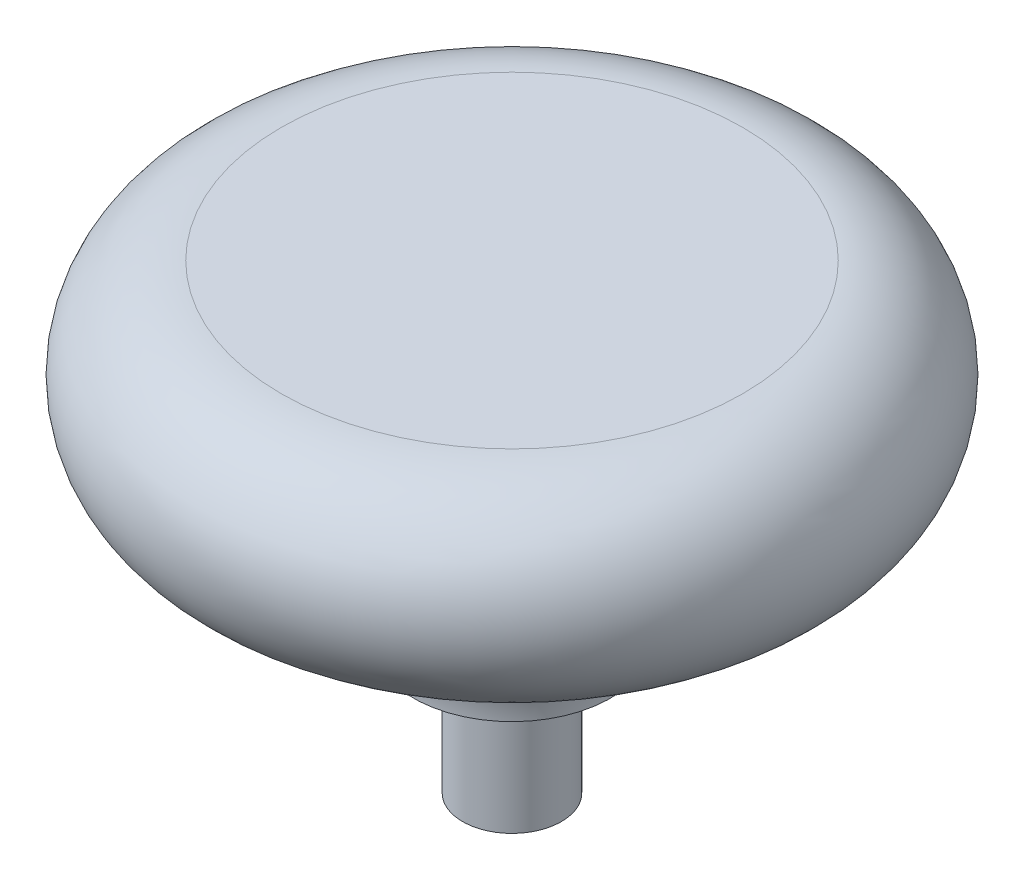
ISO-10303-21;
HEADER;
FILE_DESCRIPTION(('STEP AP214'),'2;1');
FILE_NAME('part.step','',(''),(''),'','','');
FILE_SCHEMA(('AUTOMOTIVE_DESIGN { 1 0 10303 214 1 1 1 1 }'));
ENDSEC;
DATA;
#1=APPLICATION_CONTEXT('core data for automotive mechanical design processes');
#2=APPLICATION_PROTOCOL_DEFINITION('international standard','automotive_design',2000,#1);
#3=PRODUCT_CONTEXT('',#1,'mechanical');
#4=PRODUCT('Part','Part','',(#3));
#5=PRODUCT_RELATED_PRODUCT_CATEGORY('part','',(#4));
#6=PRODUCT_DEFINITION_FORMATION('','',#4);
#7=PRODUCT_DEFINITION_CONTEXT('part definition',#1,'design');
#8=PRODUCT_DEFINITION('design','',#6,#7);
#9=PRODUCT_DEFINITION_SHAPE('','',#8);
#10=(LENGTH_UNIT() NAMED_UNIT(*) SI_UNIT(.MILLI.,.METRE.));
#11=(NAMED_UNIT(*) PLANE_ANGLE_UNIT() SI_UNIT($,.RADIAN.));
#12=(NAMED_UNIT(*) SI_UNIT($,.STERADIAN.) SOLID_ANGLE_UNIT());
#13=UNCERTAINTY_MEASURE_WITH_UNIT(LENGTH_MEASURE(1.E-05),#10,'distance_accuracy_value','');
#14=(GEOMETRIC_REPRESENTATION_CONTEXT(3) GLOBAL_UNCERTAINTY_ASSIGNED_CONTEXT((#13)) GLOBAL_UNIT_ASSIGNED_CONTEXT((#10,
#11,#12)) REPRESENTATION_CONTEXT('',''));
#15=CARTESIAN_POINT('',(0.,0.,0.));
#16=DIRECTION('',(0.,0.,1.));
#17=DIRECTION('',(1.,0.,0.));
#18=AXIS2_PLACEMENT_3D('',#15,#16,#17);
#19=CARTESIAN_POINT('',(0.,0.,0.));
#20=DIRECTION('',(0.,-1.,0.));
#21=DIRECTION('',(0.,0.,-1.));
#22=AXIS2_PLACEMENT_3D('',#19,#20,#21);
#23=PLANE('',#22);
#24=CARTESIAN_POINT('',(0.,0.,0.));
#25=DIRECTION('',(0.,-1.,0.));
#26=DIRECTION('',(0.,0.,-1.));
#27=AXIS2_PLACEMENT_3D('',#24,#25,#26);
#28=CIRCLE('',#27,2.38);
#29=CARTESIAN_POINT('',(0.,0.,-2.38));
#30=VERTEX_POINT('',#29);
#31=EDGE_CURVE('E10',#30,#30,#28,.T.);
#32=ORIENTED_EDGE('',*,*,#31,.T.);
#33=EDGE_LOOP('',(#32));
#34=FACE_BOUND('',#33,.T.);
#35=ADVANCED_FACE('F31',(#34),#23,.T.);
#36=CARTESIAN_POINT('',(0.,0.,0.));
#37=DIRECTION('',(0.,-1.,0.));
#38=DIRECTION('',(0.,0.,-1.));
#39=AXIS2_PLACEMENT_3D('',#36,#37,#38);
#40=CYLINDRICAL_SURFACE('',#39,2.38);
#41=CARTESIAN_POINT('',(0.,6.35,0.));
#42=DIRECTION('',(0.,-1.,0.));
#43=DIRECTION('',(0.,0.,-1.));
#44=AXIS2_PLACEMENT_3D('',#41,#42,#43);
#45=CIRCLE('',#44,2.38);
#46=CARTESIAN_POINT('',(0.,6.35,-2.38));
#47=VERTEX_POINT('',#46);
#48=EDGE_CURVE('E37',#47,#47,#45,.T.);
#49=ORIENTED_EDGE('',*,*,#48,.T.);
#50=EDGE_LOOP('',(#49));
#51=FACE_BOUND('',#50,.T.);
#52=ORIENTED_EDGE('',*,*,#31,.F.);
#53=EDGE_LOOP('',(#52));
#54=FACE_BOUND('',#53,.T.);
#55=ADVANCED_FACE('F66',(#51,#54),#40,.T.);
#56=CARTESIAN_POINT('',(2.38,6.35,0.));
#57=DIRECTION('',(0.,-1.,0.));
#58=DIRECTION('',(0.,0.,-1.));
#59=AXIS2_PLACEMENT_3D('',#56,#57,#58);
#60=PLANE('',#59);
#61=CARTESIAN_POINT('',(0.,6.35,0.));
#62=DIRECTION('',(0.,-1.,0.));
#63=DIRECTION('',(0.,0.,-1.));
#64=AXIS2_PLACEMENT_3D('',#61,#62,#63);
#65=CIRCLE('',#64,4.765);
#66=CARTESIAN_POINT('',(0.,6.35,-4.765));
#67=VERTEX_POINT('',#66);
#68=EDGE_CURVE('E41',#67,#67,#65,.T.);
#69=ORIENTED_EDGE('',*,*,#68,.T.);
#70=EDGE_LOOP('',(#69));
#71=FACE_BOUND('',#70,.T.);
#72=ORIENTED_EDGE('',*,*,#48,.F.);
#73=EDGE_LOOP('',(#72));
#74=FACE_BOUND('',#73,.T.);
#75=ADVANCED_FACE('F70',(#71,#74),#60,.T.);
#76=CARTESIAN_POINT('',(0.,6.35,0.));
#77=DIRECTION('',(0.,-1.,0.));
#78=DIRECTION('',(0.,0.,-1.));
#79=AXIS2_PLACEMENT_3D('',#76,#77,#78);
#80=TOROIDAL_SURFACE('',#79,11.115,6.35);
#81=CARTESIAN_POINT('',(0.,12.7,0.));
#82=DIRECTION('',(0.,-1.,0.));
#83=DIRECTION('',(0.,0.,-1.));
#84=AXIS2_PLACEMENT_3D('',#81,#82,#83);
#85=CIRCLE('',#84,11.115);
#86=CARTESIAN_POINT('',(0.,12.7,-11.115));
#87=VERTEX_POINT('',#86);
#88=EDGE_CURVE('E45',#87,#87,#85,.T.);
#89=ORIENTED_EDGE('',*,*,#88,.T.);
#90=EDGE_LOOP('',(#89));
#91=FACE_BOUND('',#90,.T.);
#92=ORIENTED_EDGE('',*,*,#68,.F.);
#93=EDGE_LOOP('',(#92));
#94=FACE_BOUND('',#93,.T.);
#95=ADVANCED_FACE('F63',(#91,#94),#80,.F.);
#96=CARTESIAN_POINT('',(0.,17.46,0.));
#97=DIRECTION('',(0.,-1.,0.));
#98=DIRECTION('',(0.,0.,-1.));
#99=AXIS2_PLACEMENT_3D('',#96,#97,#98);
#100=TOROIDAL_SURFACE('',#99,11.115,4.76);
#101=CARTESIAN_POINT('',(0.,22.22,0.));
#102=DIRECTION('',(0.,-1.,0.));
#103=DIRECTION('',(0.,0.,-1.));
#104=AXIS2_PLACEMENT_3D('',#101,#102,#103);
#105=CIRCLE('',#104,11.115);
#106=CARTESIAN_POINT('',(0.,22.22,-11.115));
#107=VERTEX_POINT('',#106);
#108=EDGE_CURVE('E50',#107,#107,#105,.T.);
#109=ORIENTED_EDGE('',*,*,#108,.T.);
#110=EDGE_LOOP('',(#109));
#111=FACE_BOUND('',#110,.T.);
#112=ORIENTED_EDGE('',*,*,#88,.F.);
#113=EDGE_LOOP('',(#112));
#114=FACE_BOUND('',#113,.T.);
#115=ADVANCED_FACE('F54',(#111,#114),#100,.T.);
#116=CARTESIAN_POINT('',(11.115,22.22,0.));
#117=DIRECTION('',(0.,1.,0.));
#118=DIRECTION('',(0.,0.,1.));
#119=AXIS2_PLACEMENT_3D('',#116,#117,#118);
#120=PLANE('',#119);
#121=ORIENTED_EDGE('',*,*,#108,.F.);
#122=EDGE_LOOP('',(#121));
#123=FACE_BOUND('',#122,.T.);
#124=ADVANCED_FACE('F57',(#123),#120,.T.);
#125=CLOSED_SHELL('',(#35,#55,#75,#95,#115,#124));
#126=MANIFOLD_SOLID_BREP('B2',#125);
#127=ADVANCED_BREP_SHAPE_REPRESENTATION('',(#18,#126),#14);
#128=SHAPE_DEFINITION_REPRESENTATION(#9,#127);
ENDSEC;
END-ISO-10303-21;
